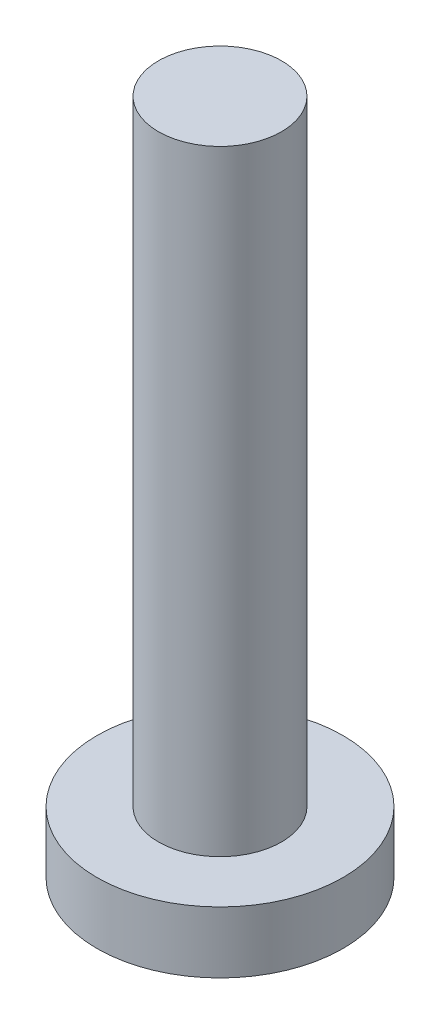
ISO-10303-21;
HEADER;
FILE_DESCRIPTION(('STEP AP214'),'2;1');
FILE_NAME('part.step','',(''),(''),'','','');
FILE_SCHEMA(('AUTOMOTIVE_DESIGN { 1 0 10303 214 1 1 1 1 }'));
ENDSEC;
DATA;
#1=APPLICATION_CONTEXT('core data for automotive mechanical design processes');
#2=APPLICATION_PROTOCOL_DEFINITION('international standard','automotive_design',2000,#1);
#3=PRODUCT_CONTEXT('',#1,'mechanical');
#4=PRODUCT('Part','Part','',(#3));
#5=PRODUCT_RELATED_PRODUCT_CATEGORY('part','',(#4));
#6=PRODUCT_DEFINITION_FORMATION('','',#4);
#7=PRODUCT_DEFINITION_CONTEXT('part definition',#1,'design');
#8=PRODUCT_DEFINITION('design','',#6,#7);
#9=PRODUCT_DEFINITION_SHAPE('','',#8);
#10=(LENGTH_UNIT() NAMED_UNIT(*) SI_UNIT(.MILLI.,.METRE.));
#11=(NAMED_UNIT(*) PLANE_ANGLE_UNIT() SI_UNIT($,.RADIAN.));
#12=(NAMED_UNIT(*) SI_UNIT($,.STERADIAN.) SOLID_ANGLE_UNIT());
#13=UNCERTAINTY_MEASURE_WITH_UNIT(LENGTH_MEASURE(1.E-05),#10,'distance_accuracy_value','');
#14=(GEOMETRIC_REPRESENTATION_CONTEXT(3) GLOBAL_UNCERTAINTY_ASSIGNED_CONTEXT((#13)) GLOBAL_UNIT_ASSIGNED_CONTEXT((#10,
#11,#12)) REPRESENTATION_CONTEXT('',''));
#15=CARTESIAN_POINT('',(0.,0.,0.));
#16=DIRECTION('',(0.,0.,1.));
#17=DIRECTION('',(1.,0.,0.));
#18=AXIS2_PLACEMENT_3D('',#15,#16,#17);
#19=CARTESIAN_POINT('',(0.,5.,0.));
#20=DIRECTION('',(0.,-1.,0.));
#21=DIRECTION('',(0.,0.,-1.));
#22=AXIS2_PLACEMENT_3D('',#19,#20,#21);
#23=CYLINDRICAL_SURFACE('',#22,10.);
#24=CARTESIAN_POINT('',(0.,5.,0.));
#25=DIRECTION('',(0.,1.,0.));
#26=DIRECTION('',(0.,0.,1.));
#27=AXIS2_PLACEMENT_3D('',#24,#25,#26);
#28=CIRCLE('',#27,10.);
#29=CARTESIAN_POINT('',(0.,5.,10.));
#30=VERTEX_POINT('',#29);
#31=EDGE_CURVE('E44',#30,#30,#28,.T.);
#32=ORIENTED_EDGE('',*,*,#31,.F.);
#33=EDGE_LOOP('',(#32));
#34=FACE_BOUND('',#33,.T.);
#35=CARTESIAN_POINT('',(0.,0.,0.));
#36=DIRECTION('',(0.,1.,0.));
#37=DIRECTION('',(0.,0.,1.));
#38=AXIS2_PLACEMENT_3D('',#35,#36,#37);
#39=CIRCLE('',#38,10.);
#40=CARTESIAN_POINT('',(0.,0.,10.));
#41=VERTEX_POINT('',#40);
#42=EDGE_CURVE('E39',#41,#41,#39,.T.);
#43=ORIENTED_EDGE('',*,*,#42,.T.);
#44=EDGE_LOOP('',(#43));
#45=FACE_BOUND('',#44,.T.);
#46=ADVANCED_FACE('F36',(#34,#45),#23,.T.);
#47=CARTESIAN_POINT('',(0.,5.,0.));
#48=DIRECTION('',(0.,1.,0.));
#49=DIRECTION('',(0.,0.,1.));
#50=AXIS2_PLACEMENT_3D('',#47,#48,#49);
#51=PLANE('',#50);
#52=CARTESIAN_POINT('',(0.,5.,0.));
#53=DIRECTION('',(0.,1.,0.));
#54=DIRECTION('',(0.,0.,1.));
#55=AXIS2_PLACEMENT_3D('',#52,#53,#54);
#56=CIRCLE('',#55,5.);
#57=CARTESIAN_POINT('',(0.,5.,5.));
#58=VERTEX_POINT('',#57);
#59=EDGE_CURVE('E10',#58,#58,#56,.T.);
#60=ORIENTED_EDGE('',*,*,#59,.F.);
#61=EDGE_LOOP('',(#60));
#62=FACE_BOUND('',#61,.T.);
#63=ORIENTED_EDGE('',*,*,#31,.T.);
#64=EDGE_LOOP('',(#63));
#65=FACE_BOUND('',#64,.T.);
#66=ADVANCED_FACE('F66',(#62,#65),#51,.T.);
#67=CARTESIAN_POINT('',(0.,0.,0.));
#68=DIRECTION('',(0.,1.,0.));
#69=DIRECTION('',(0.,0.,1.));
#70=AXIS2_PLACEMENT_3D('',#67,#68,#69);
#71=PLANE('',#70);
#72=ORIENTED_EDGE('',*,*,#42,.F.);
#73=EDGE_LOOP('',(#72));
#74=FACE_BOUND('',#73,.T.);
#75=ADVANCED_FACE('F63',(#74),#71,.F.);
#76=CARTESIAN_POINT('',(0.,55.,0.));
#77=DIRECTION('',(0.,-1.,0.));
#78=DIRECTION('',(0.,0.,-1.));
#79=AXIS2_PLACEMENT_3D('',#76,#77,#78);
#80=CYLINDRICAL_SURFACE('',#79,5.);
#81=CARTESIAN_POINT('',(0.,55.,0.));
#82=DIRECTION('',(0.,1.,0.));
#83=DIRECTION('',(0.,0.,1.));
#84=AXIS2_PLACEMENT_3D('',#81,#82,#83);
#85=CIRCLE('',#84,5.);
#86=CARTESIAN_POINT('',(0.,55.,5.));
#87=VERTEX_POINT('',#86);
#88=EDGE_CURVE('E53',#87,#87,#85,.T.);
#89=ORIENTED_EDGE('',*,*,#88,.F.);
#90=EDGE_LOOP('',(#89));
#91=FACE_BOUND('',#90,.T.);
#92=ORIENTED_EDGE('',*,*,#59,.T.);
#93=EDGE_LOOP('',(#92));
#94=FACE_BOUND('',#93,.T.);
#95=ADVANCED_FACE('F65',(#91,#94),#80,.T.);
#96=CARTESIAN_POINT('',(0.,55.,0.));
#97=DIRECTION('',(0.,1.,0.));
#98=DIRECTION('',(0.,0.,1.));
#99=AXIS2_PLACEMENT_3D('',#96,#97,#98);
#100=PLANE('',#99);
#101=ORIENTED_EDGE('',*,*,#88,.T.);
#102=EDGE_LOOP('',(#101));
#103=FACE_BOUND('',#102,.T.);
#104=ADVANCED_FACE('F71',(#103),#100,.T.);
#105=CLOSED_SHELL('',(#46,#66,#75,#95,#104));
#106=MANIFOLD_SOLID_BREP('B2',#105);
#107=ADVANCED_BREP_SHAPE_REPRESENTATION('',(#18,#106),#14);
#108=SHAPE_DEFINITION_REPRESENTATION(#9,#107);
ENDSEC;
END-ISO-10303-21;
